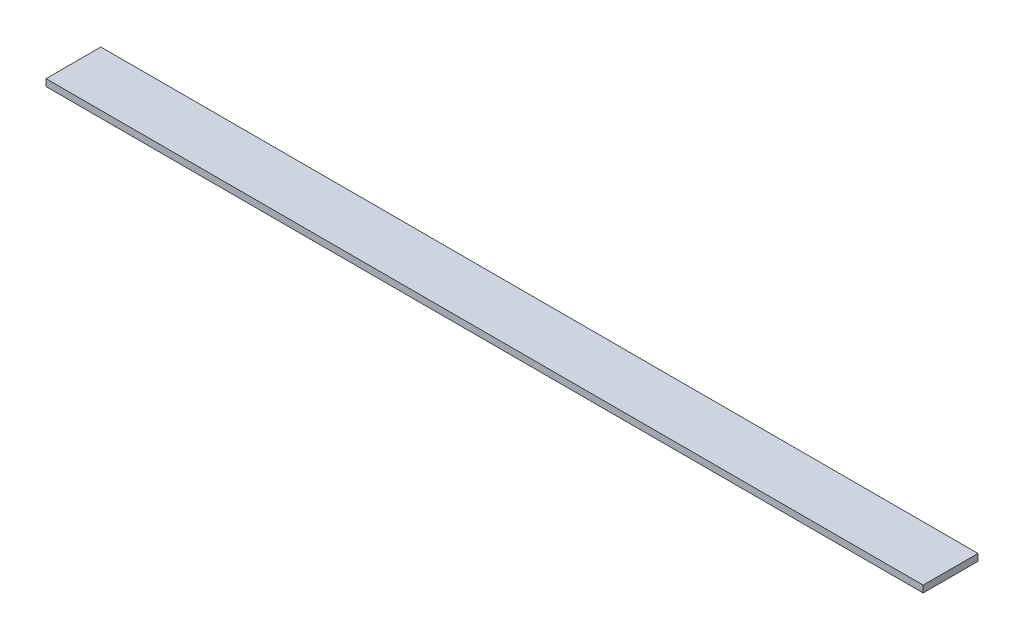
ISO-10303-21;
HEADER;
FILE_DESCRIPTION(('STEP AP214'),'2;1');
FILE_NAME('part.step','',(''),(''),'','','');
FILE_SCHEMA(('AUTOMOTIVE_DESIGN { 1 0 10303 214 1 1 1 1 }'));
ENDSEC;
DATA;
#1=APPLICATION_CONTEXT('core data for automotive mechanical design processes');
#2=APPLICATION_PROTOCOL_DEFINITION('international standard','automotive_design',2000,#1);
#3=PRODUCT_CONTEXT('',#1,'mechanical');
#4=PRODUCT('Part','Part','',(#3));
#5=PRODUCT_RELATED_PRODUCT_CATEGORY('part','',(#4));
#6=PRODUCT_DEFINITION_FORMATION('','',#4);
#7=PRODUCT_DEFINITION_CONTEXT('part definition',#1,'design');
#8=PRODUCT_DEFINITION('design','',#6,#7);
#9=PRODUCT_DEFINITION_SHAPE('','',#8);
#10=(LENGTH_UNIT() NAMED_UNIT(*) SI_UNIT(.MILLI.,.METRE.));
#11=(NAMED_UNIT(*) PLANE_ANGLE_UNIT() SI_UNIT($,.RADIAN.));
#12=(NAMED_UNIT(*) SI_UNIT($,.STERADIAN.) SOLID_ANGLE_UNIT());
#13=UNCERTAINTY_MEASURE_WITH_UNIT(LENGTH_MEASURE(1.E-05),#10,'distance_accuracy_value','');
#14=(GEOMETRIC_REPRESENTATION_CONTEXT(3) GLOBAL_UNCERTAINTY_ASSIGNED_CONTEXT((#13)) GLOBAL_UNIT_ASSIGNED_CONTEXT((#10,
#11,#12)) REPRESENTATION_CONTEXT('',''));
#15=CARTESIAN_POINT('',(0.,0.,0.));
#16=DIRECTION('',(0.,0.,1.));
#17=DIRECTION('',(1.,0.,0.));
#18=AXIS2_PLACEMENT_3D('',#15,#16,#17);
#19=CARTESIAN_POINT('',(203.2,-3.175,12.7));
#20=DIRECTION('',(1.,0.,0.));
#21=DIRECTION('',(0.,0.,-1.));
#22=AXIS2_PLACEMENT_3D('',#19,#20,#21);
#23=PLANE('',#22);
#24=DIRECTION('',(0.,0.,-1.));
#25=VECTOR('',#24,1.);
#26=CARTESIAN_POINT('',(203.2,0.,12.7));
#27=LINE('',#26,#25);
#28=CARTESIAN_POINT('',(203.2,0.,12.7));
#29=VERTEX_POINT('',#28);
#30=CARTESIAN_POINT('',(203.2,0.,-12.7));
#31=VERTEX_POINT('',#30);
#32=EDGE_CURVE('E105',#29,#31,#27,.T.);
#33=ORIENTED_EDGE('',*,*,#32,.F.);
#34=DIRECTION('',(0.,1.,0.));
#35=VECTOR('',#34,1.);
#36=CARTESIAN_POINT('',(203.2,-3.175,12.7));
#37=LINE('',#36,#35);
#38=CARTESIAN_POINT('',(203.2,-3.175,12.7));
#39=VERTEX_POINT('',#38);
#40=EDGE_CURVE('E11',#39,#29,#37,.T.);
#41=ORIENTED_EDGE('',*,*,#40,.F.);
#42=DIRECTION('',(0.,0.,-1.));
#43=VECTOR('',#42,1.);
#44=CARTESIAN_POINT('',(203.2,-3.175,12.7));
#45=LINE('',#44,#43);
#46=CARTESIAN_POINT('',(203.2,-3.175,-12.7));
#47=VERTEX_POINT('',#46);
#48=EDGE_CURVE('E99',#39,#47,#45,.T.);
#49=ORIENTED_EDGE('',*,*,#48,.T.);
#50=DIRECTION('',(0.,1.,0.));
#51=VECTOR('',#50,1.);
#52=CARTESIAN_POINT('',(203.2,-3.175,-12.7));
#53=LINE('',#52,#51);
#54=EDGE_CURVE('E44',#47,#31,#53,.T.);
#55=ORIENTED_EDGE('',*,*,#54,.T.);
#56=EDGE_LOOP('',(#33,#41,#49,#55));
#57=FACE_BOUND('',#56,.T.);
#58=ADVANCED_FACE('F41',(#57),#23,.T.);
#59=CARTESIAN_POINT('',(-203.2,-3.175,12.7));
#60=DIRECTION('',(0.,0.,1.));
#61=DIRECTION('',(1.,0.,0.));
#62=AXIS2_PLACEMENT_3D('',#59,#60,#61);
#63=PLANE('',#62);
#64=DIRECTION('',(1.,0.,0.));
#65=VECTOR('',#64,1.);
#66=CARTESIAN_POINT('',(-203.2,0.,12.7));
#67=LINE('',#66,#65);
#68=CARTESIAN_POINT('',(-203.2,0.,12.7));
#69=VERTEX_POINT('',#68);
#70=EDGE_CURVE('E101',#69,#29,#67,.T.);
#71=ORIENTED_EDGE('',*,*,#70,.F.);
#72=DIRECTION('',(0.,1.,0.));
#73=VECTOR('',#72,1.);
#74=CARTESIAN_POINT('',(-203.2,-3.175,12.7));
#75=LINE('',#74,#73);
#76=CARTESIAN_POINT('',(-203.2,-3.175,12.7));
#77=VERTEX_POINT('',#76);
#78=EDGE_CURVE('E50',#77,#69,#75,.T.);
#79=ORIENTED_EDGE('',*,*,#78,.F.);
#80=DIRECTION('',(1.,0.,0.));
#81=VECTOR('',#80,1.);
#82=CARTESIAN_POINT('',(-203.2,-3.175,12.7));
#83=LINE('',#82,#81);
#84=EDGE_CURVE('E96',#77,#39,#83,.T.);
#85=ORIENTED_EDGE('',*,*,#84,.T.);
#86=ORIENTED_EDGE('',*,*,#40,.T.);
#87=EDGE_LOOP('',(#71,#79,#85,#86));
#88=FACE_BOUND('',#87,.T.);
#89=ADVANCED_FACE('F115',(#88),#63,.T.);
#90=CARTESIAN_POINT('',(-203.2,-3.175,12.7));
#91=DIRECTION('',(-1.,0.,0.));
#92=DIRECTION('',(0.,0.,1.));
#93=AXIS2_PLACEMENT_3D('',#90,#91,#92);
#94=PLANE('',#93);
#95=DIRECTION('',(0.,0.,1.));
#96=VECTOR('',#95,1.);
#97=CARTESIAN_POINT('',(-203.2,0.,12.7));
#98=LINE('',#97,#96);
#99=CARTESIAN_POINT('',(-203.2,0.,-12.7));
#100=VERTEX_POINT('',#99);
#101=EDGE_CURVE('E91',#100,#69,#98,.T.);
#102=ORIENTED_EDGE('',*,*,#101,.F.);
#103=DIRECTION('',(0.,1.,0.));
#104=VECTOR('',#103,1.);
#105=CARTESIAN_POINT('',(-203.2,-3.175,-12.7));
#106=LINE('',#105,#104);
#107=CARTESIAN_POINT('',(-203.2,-3.175,-12.7));
#108=VERTEX_POINT('',#107);
#109=EDGE_CURVE('E86',#108,#100,#106,.T.);
#110=ORIENTED_EDGE('',*,*,#109,.F.);
#111=DIRECTION('',(0.,0.,1.));
#112=VECTOR('',#111,1.);
#113=CARTESIAN_POINT('',(-203.2,-3.175,12.7));
#114=LINE('',#113,#112);
#115=EDGE_CURVE('E89',#108,#77,#114,.T.);
#116=ORIENTED_EDGE('',*,*,#115,.T.);
#117=ORIENTED_EDGE('',*,*,#78,.T.);
#118=EDGE_LOOP('',(#102,#110,#116,#117));
#119=FACE_BOUND('',#118,.T.);
#120=ADVANCED_FACE('F88',(#119),#94,.T.);
#121=CARTESIAN_POINT('',(-203.2,-3.175,-12.7));
#122=DIRECTION('',(0.,0.,-1.));
#123=DIRECTION('',(-1.,0.,0.));
#124=AXIS2_PLACEMENT_3D('',#121,#122,#123);
#125=PLANE('',#124);
#126=DIRECTION('',(-1.,0.,0.));
#127=VECTOR('',#126,1.);
#128=CARTESIAN_POINT('',(-203.2,0.,-12.7));
#129=LINE('',#128,#127);
#130=EDGE_CURVE('E108',#31,#100,#129,.T.);
#131=ORIENTED_EDGE('',*,*,#130,.F.);
#132=ORIENTED_EDGE('',*,*,#54,.F.);
#133=DIRECTION('',(-1.,0.,0.));
#134=VECTOR('',#133,1.);
#135=CARTESIAN_POINT('',(-203.2,-3.175,-12.7));
#136=LINE('',#135,#134);
#137=EDGE_CURVE('E95',#47,#108,#136,.T.);
#138=ORIENTED_EDGE('',*,*,#137,.T.);
#139=ORIENTED_EDGE('',*,*,#109,.T.);
#140=EDGE_LOOP('',(#131,#132,#138,#139));
#141=FACE_BOUND('',#140,.T.);
#142=ADVANCED_FACE('F98',(#141),#125,.T.);
#143=CARTESIAN_POINT('',(0.,-3.175,0.));
#144=DIRECTION('',(0.,-1.,0.));
#145=DIRECTION('',(0.,0.,-1.));
#146=AXIS2_PLACEMENT_3D('',#143,#144,#145);
#147=PLANE('',#146);
#148=ORIENTED_EDGE('',*,*,#48,.F.);
#149=ORIENTED_EDGE('',*,*,#84,.F.);
#150=ORIENTED_EDGE('',*,*,#115,.F.);
#151=ORIENTED_EDGE('',*,*,#137,.F.);
#152=EDGE_LOOP('',(#148,#149,#150,#151));
#153=FACE_BOUND('',#152,.T.);
#154=ADVANCED_FACE('F94',(#153),#147,.T.);
#155=CARTESIAN_POINT('',(0.,0.,0.));
#156=DIRECTION('',(0.,-1.,0.));
#157=DIRECTION('',(0.,0.,-1.));
#158=AXIS2_PLACEMENT_3D('',#155,#156,#157);
#159=PLANE('',#158);
#160=ORIENTED_EDGE('',*,*,#32,.T.);
#161=ORIENTED_EDGE('',*,*,#130,.T.);
#162=ORIENTED_EDGE('',*,*,#101,.T.);
#163=ORIENTED_EDGE('',*,*,#70,.T.);
#164=EDGE_LOOP('',(#160,#161,#162,#163));
#165=FACE_BOUND('',#164,.T.);
#166=ADVANCED_FACE('F114',(#165),#159,.F.);
#167=CLOSED_SHELL('',(#58,#89,#120,#142,#154,#166));
#168=MANIFOLD_SOLID_BREP('B2',#167);
#169=ADVANCED_BREP_SHAPE_REPRESENTATION('',(#18,#168),#14);
#170=SHAPE_DEFINITION_REPRESENTATION(#9,#169);
ENDSEC;
END-ISO-10303-21;
